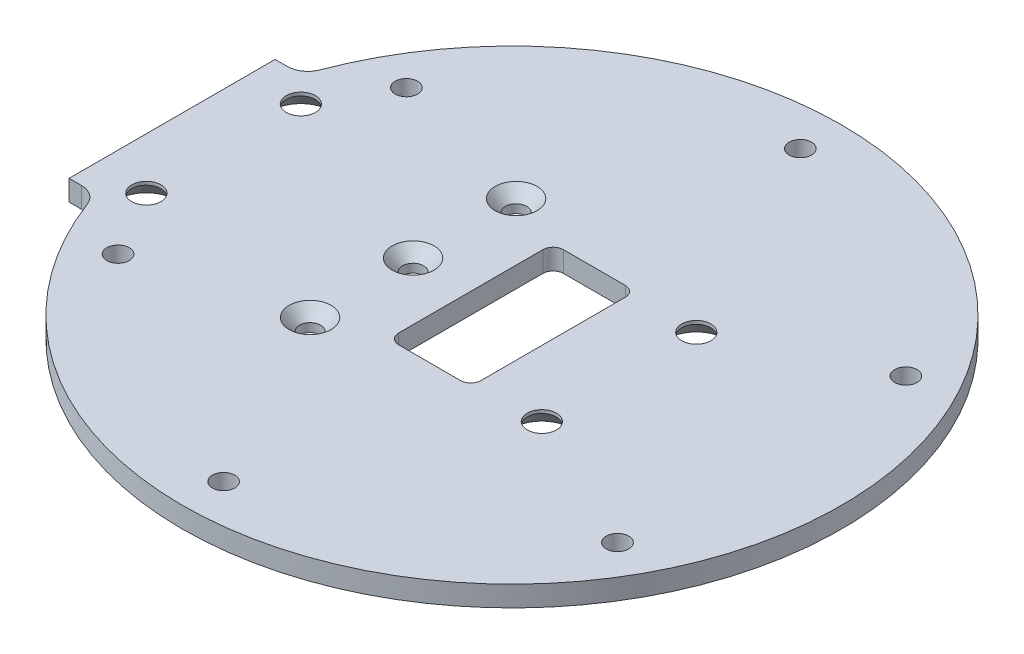
ISO-10303-21;
HEADER;
FILE_DESCRIPTION(('STEP AP214'),'2;1');
FILE_NAME('part.step','',(''),(''),'','','');
FILE_SCHEMA(('AUTOMOTIVE_DESIGN { 1 0 10303 214 1 1 1 1 }'));
ENDSEC;
DATA;
#1=APPLICATION_CONTEXT('core data for automotive mechanical design processes');
#2=APPLICATION_PROTOCOL_DEFINITION('international standard','automotive_design',2000,#1);
#3=PRODUCT_CONTEXT('',#1,'mechanical');
#4=PRODUCT('Part','Part','',(#3));
#5=PRODUCT_RELATED_PRODUCT_CATEGORY('part','',(#4));
#6=PRODUCT_DEFINITION_FORMATION('','',#4);
#7=PRODUCT_DEFINITION_CONTEXT('part definition',#1,'design');
#8=PRODUCT_DEFINITION('design','',#6,#7);
#9=PRODUCT_DEFINITION_SHAPE('','',#8);
#10=(LENGTH_UNIT() NAMED_UNIT(*) SI_UNIT(.MILLI.,.METRE.));
#11=(NAMED_UNIT(*) PLANE_ANGLE_UNIT() SI_UNIT($,.RADIAN.));
#12=(NAMED_UNIT(*) SI_UNIT($,.STERADIAN.) SOLID_ANGLE_UNIT());
#13=UNCERTAINTY_MEASURE_WITH_UNIT(LENGTH_MEASURE(1.E-05),#10,'distance_accuracy_value','');
#14=(GEOMETRIC_REPRESENTATION_CONTEXT(3) GLOBAL_UNCERTAINTY_ASSIGNED_CONTEXT((#13)) GLOBAL_UNIT_ASSIGNED_CONTEXT((#10,
#11,#12)) REPRESENTATION_CONTEXT('',''));
#15=CARTESIAN_POINT('',(0.,0.,0.));
#16=DIRECTION('',(0.,0.,1.));
#17=DIRECTION('',(1.,0.,0.));
#18=AXIS2_PLACEMENT_3D('',#15,#16,#17);
#19=CARTESIAN_POINT('',(0.,3.175,0.));
#20=DIRECTION('',(0.,-1.,0.));
#21=DIRECTION('',(0.,0.,-1.));
#22=AXIS2_PLACEMENT_3D('',#19,#20,#21);
#23=CYLINDRICAL_SURFACE('',#22,50.8);
#24=CARTESIAN_POINT('',(0.,0.,0.));
#25=DIRECTION('',(0.,1.,0.));
#26=DIRECTION('',(0.,0.,1.));
#27=AXIS2_PLACEMENT_3D('',#24,#25,#26);
#28=CIRCLE('',#27,50.8);
#29=CARTESIAN_POINT('',(-47.5307920591655,0.,17.9294117647059));
#30=VERTEX_POINT('',#29);
#31=CARTESIAN_POINT('',(-47.5307920591654,0.,-17.9294117647059));
#32=VERTEX_POINT('',#31);
#33=EDGE_CURVE('E163',#30,#32,#28,.T.);
#34=ORIENTED_EDGE('',*,*,#33,.T.);
#35=DIRECTION('',(0.,-1.,0.));
#36=VECTOR('',#35,1.);
#37=CARTESIAN_POINT('',(-47.5307920591655,3.175,-17.9294117647059));
#38=LINE('',#37,#36);
#39=CARTESIAN_POINT('',(-47.5307920591654,3.175,-17.9294117647059));
#40=VERTEX_POINT('',#39);
#41=EDGE_CURVE('E183',#32,#40,#38,.F.);
#42=ORIENTED_EDGE('',*,*,#41,.T.);
#43=CARTESIAN_POINT('',(0.,3.175,0.));
#44=DIRECTION('',(0.,1.,0.));
#45=DIRECTION('',(0.,0.,1.));
#46=AXIS2_PLACEMENT_3D('',#43,#44,#45);
#47=CIRCLE('',#46,50.8);
#48=CARTESIAN_POINT('',(-47.5307920591655,3.175,17.9294117647059));
#49=VERTEX_POINT('',#48);
#50=EDGE_CURVE('E166',#49,#40,#47,.T.);
#51=ORIENTED_EDGE('',*,*,#50,.F.);
#52=DIRECTION('',(0.,-1.,0.));
#53=VECTOR('',#52,1.);
#54=CARTESIAN_POINT('',(-47.5307920591655,3.175,17.9294117647059));
#55=LINE('',#54,#53);
#56=EDGE_CURVE('E180',#49,#30,#55,.T.);
#57=ORIENTED_EDGE('',*,*,#56,.T.);
#58=EDGE_LOOP('',(#34,#42,#51,#57));
#59=FACE_BOUND('',#58,.T.);
#60=ADVANCED_FACE('F36',(#59),#23,.T.);
#61=CARTESIAN_POINT('',(0.,3.175,0.));
#62=DIRECTION('',(0.,1.,0.));
#63=DIRECTION('',(0.,0.,1.));
#64=AXIS2_PLACEMENT_3D('',#61,#62,#63);
#65=PLANE('',#64);
#66=DIRECTION('',(0.,0.,1.));
#67=VECTOR('',#66,1.);
#68=CARTESIAN_POINT('',(-6.35,3.175,-12.7));
#69=LINE('',#68,#67);
#70=CARTESIAN_POINT('',(-6.35,3.175,-11.1125));
#71=VERTEX_POINT('',#70);
#72=CARTESIAN_POINT('',(-6.35,3.175,11.1125));
#73=VERTEX_POINT('',#72);
#74=EDGE_CURVE('E260',#71,#73,#69,.T.);
#75=ORIENTED_EDGE('',*,*,#74,.F.);
#76=CARTESIAN_POINT('',(-4.7625,3.175,-11.1125));
#77=DIRECTION('',(0.,1.,0.));
#78=DIRECTION('',(0.,0.,1.));
#79=AXIS2_PLACEMENT_3D('',#76,#77,#78);
#80=CIRCLE('',#79,1.5875);
#81=CARTESIAN_POINT('',(-4.7625,3.175,-12.7));
#82=VERTEX_POINT('',#81);
#83=EDGE_CURVE('E238',#71,#82,#80,.F.);
#84=ORIENTED_EDGE('',*,*,#83,.T.);
#85=DIRECTION('',(-1.,0.,0.));
#86=VECTOR('',#85,1.);
#87=CARTESIAN_POINT('',(6.35,3.175,-12.7));
#88=LINE('',#87,#86);
#89=CARTESIAN_POINT('',(4.7625,3.175,-12.7));
#90=VERTEX_POINT('',#89);
#91=EDGE_CURVE('E285',#90,#82,#88,.T.);
#92=ORIENTED_EDGE('',*,*,#91,.F.);
#93=CARTESIAN_POINT('',(4.7625,3.175,-11.1125));
#94=DIRECTION('',(0.,1.,0.));
#95=DIRECTION('',(0.,0.,1.));
#96=AXIS2_PLACEMENT_3D('',#93,#94,#95);
#97=CIRCLE('',#96,1.5875);
#98=CARTESIAN_POINT('',(6.35,3.175,-11.1125));
#99=VERTEX_POINT('',#98);
#100=EDGE_CURVE('E242',#90,#99,#97,.F.);
#101=ORIENTED_EDGE('',*,*,#100,.T.);
#102=DIRECTION('',(0.,0.,-1.));
#103=VECTOR('',#102,1.);
#104=CARTESIAN_POINT('',(6.35,3.175,-12.7));
#105=LINE('',#104,#103);
#106=CARTESIAN_POINT('',(6.35,3.175,11.1125));
#107=VERTEX_POINT('',#106);
#108=EDGE_CURVE('E255',#107,#99,#105,.T.);
#109=ORIENTED_EDGE('',*,*,#108,.F.);
#110=CARTESIAN_POINT('',(4.7625,3.175,11.1125));
#111=DIRECTION('',(0.,1.,0.));
#112=DIRECTION('',(0.,0.,1.));
#113=AXIS2_PLACEMENT_3D('',#110,#111,#112);
#114=CIRCLE('',#113,1.5875);
#115=CARTESIAN_POINT('',(4.7625,3.175,12.7));
#116=VERTEX_POINT('',#115);
#117=EDGE_CURVE('E44',#107,#116,#114,.F.);
#118=ORIENTED_EDGE('',*,*,#117,.T.);
#119=DIRECTION('',(1.,0.,0.));
#120=VECTOR('',#119,1.);
#121=CARTESIAN_POINT('',(6.35,3.175,12.7));
#122=LINE('',#121,#120);
#123=CARTESIAN_POINT('',(-4.7625,3.175,12.7));
#124=VERTEX_POINT('',#123);
#125=EDGE_CURVE('E253',#124,#116,#122,.T.);
#126=ORIENTED_EDGE('',*,*,#125,.F.);
#127=CARTESIAN_POINT('',(-4.7625,3.175,11.1125));
#128=DIRECTION('',(0.,1.,0.));
#129=DIRECTION('',(0.,0.,1.));
#130=AXIS2_PLACEMENT_3D('',#127,#128,#129);
#131=CIRCLE('',#130,1.5875);
#132=EDGE_CURVE('E246',#124,#73,#131,.F.);
#133=ORIENTED_EDGE('',*,*,#132,.T.);
#134=EDGE_LOOP('',(#75,#84,#92,#101,#109,#118,#126,#133));
#135=FACE_BOUND('',#134,.T.);
#136=CARTESIAN_POINT('',(-15.24,3.175,0.));
#137=DIRECTION('',(0.,1.,0.));
#138=DIRECTION('',(0.,0.,1.));
#139=AXIS2_PLACEMENT_3D('',#136,#137,#138);
#140=CIRCLE('',#139,3.2385);
#141=CARTESIAN_POINT('',(-15.24,3.175,3.2385));
#142=VERTEX_POINT('',#141);
#143=EDGE_CURVE('E276',#142,#142,#140,.T.);
#144=ORIENTED_EDGE('',*,*,#143,.F.);
#145=EDGE_LOOP('',(#144));
#146=FACE_BOUND('',#145,.T.);
#147=CARTESIAN_POINT('',(-15.24,3.175,-15.875));
#148=DIRECTION('',(0.,1.,0.));
#149=DIRECTION('',(0.,0.,1.));
#150=AXIS2_PLACEMENT_3D('',#147,#148,#149);
#151=CIRCLE('',#150,3.2385);
#152=CARTESIAN_POINT('',(-15.24,3.175,-12.6365));
#153=VERTEX_POINT('',#152);
#154=EDGE_CURVE('E296',#153,#153,#151,.T.);
#155=ORIENTED_EDGE('',*,*,#154,.F.);
#156=EDGE_LOOP('',(#155));
#157=FACE_BOUND('',#156,.T.);
#158=CARTESIAN_POINT('',(-15.24,3.175,15.875));
#159=DIRECTION('',(0.,1.,0.));
#160=DIRECTION('',(0.,0.,1.));
#161=AXIS2_PLACEMENT_3D('',#158,#159,#160);
#162=CIRCLE('',#161,3.2385);
#163=CARTESIAN_POINT('',(-15.24,3.175,19.1135));
#164=VERTEX_POINT('',#163);
#165=EDGE_CURVE('E305',#164,#164,#162,.T.);
#166=ORIENTED_EDGE('',*,*,#165,.F.);
#167=EDGE_LOOP('',(#166));
#168=FACE_BOUND('',#167,.T.);
#169=CARTESIAN_POINT('',(38.494829198218,3.175,-22.2250000000004));
#170=DIRECTION('',(0.,1.,0.));
#171=DIRECTION('',(0.,0.,1.));
#172=AXIS2_PLACEMENT_3D('',#169,#170,#171);
#173=CIRCLE('',#172,1.7272);
#174=CARTESIAN_POINT('',(38.494829198218,3.175,-20.4978000000004));
#175=VERTEX_POINT('',#174);
#176=EDGE_CURVE('E219',#175,#175,#173,.T.);
#177=ORIENTED_EDGE('',*,*,#176,.F.);
#178=EDGE_LOOP('',(#177));
#179=FACE_BOUND('',#178,.T.);
#180=CARTESIAN_POINT('',(38.4948291982185,3.175,22.2249999999996));
#181=DIRECTION('',(0.,1.,0.));
#182=DIRECTION('',(0.,0.,1.));
#183=AXIS2_PLACEMENT_3D('',#180,#181,#182);
#184=CIRCLE('',#183,1.7272);
#185=CARTESIAN_POINT('',(38.4948291982185,3.175,23.9521999999996));
#186=VERTEX_POINT('',#185);
#187=EDGE_CURVE('E215',#186,#186,#184,.T.);
#188=ORIENTED_EDGE('',*,*,#187,.F.);
#189=EDGE_LOOP('',(#188));
#190=FACE_BOUND('',#189,.T.);
#191=CARTESIAN_POINT('',(0.,3.175,44.45));
#192=DIRECTION('',(0.,1.,0.));
#193=DIRECTION('',(0.,0.,1.));
#194=AXIS2_PLACEMENT_3D('',#191,#192,#193);
#195=CIRCLE('',#194,1.7272);
#196=CARTESIAN_POINT('',(0.,3.175,46.1772));
#197=VERTEX_POINT('',#196);
#198=EDGE_CURVE('E211',#197,#197,#195,.T.);
#199=ORIENTED_EDGE('',*,*,#198,.F.);
#200=EDGE_LOOP('',(#199));
#201=FACE_BOUND('',#200,.T.);
#202=CARTESIAN_POINT('',(-38.4948291982182,3.175,22.2250000000002));
#203=DIRECTION('',(0.,1.,0.));
#204=DIRECTION('',(0.,0.,1.));
#205=AXIS2_PLACEMENT_3D('',#202,#203,#204);
#206=CIRCLE('',#205,1.7272);
#207=CARTESIAN_POINT('',(-38.4948291982182,3.175,23.9522000000002));
#208=VERTEX_POINT('',#207);
#209=EDGE_CURVE('E207',#208,#208,#206,.T.);
#210=ORIENTED_EDGE('',*,*,#209,.F.);
#211=EDGE_LOOP('',(#210));
#212=FACE_BOUND('',#211,.T.);
#213=CARTESIAN_POINT('',(-38.4948291982183,3.175,-22.2249999999999));
#214=DIRECTION('',(0.,1.,0.));
#215=DIRECTION('',(0.,0.,1.));
#216=AXIS2_PLACEMENT_3D('',#213,#214,#215);
#217=CIRCLE('',#216,1.7272);
#218=CARTESIAN_POINT('',(-38.4948291982183,3.175,-20.4977999999999));
#219=VERTEX_POINT('',#218);
#220=EDGE_CURVE('E203',#219,#219,#217,.T.);
#221=ORIENTED_EDGE('',*,*,#220,.F.);
#222=EDGE_LOOP('',(#221));
#223=FACE_BOUND('',#222,.T.);
#224=CARTESIAN_POINT('',(0.,3.175,-44.45));
#225=DIRECTION('',(0.,1.,0.));
#226=DIRECTION('',(0.,0.,1.));
#227=AXIS2_PLACEMENT_3D('',#224,#225,#226);
#228=CIRCLE('',#227,1.7272);
#229=CARTESIAN_POINT('',(0.,3.175,-42.7228));
#230=VERTEX_POINT('',#229);
#231=EDGE_CURVE('E199',#230,#230,#228,.T.);
#232=ORIENTED_EDGE('',*,*,#231,.F.);
#233=EDGE_LOOP('',(#232));
#234=FACE_BOUND('',#233,.T.);
#235=CARTESIAN_POINT('',(-44.45,3.175,11.90625));
#236=DIRECTION('',(0.,-1.,0.));
#237=DIRECTION('',(0.,0.,-1.));
#238=AXIS2_PLACEMENT_3D('',#235,#236,#237);
#239=CIRCLE('',#238,2.2479);
#240=CARTESIAN_POINT('',(-44.45,3.175,9.65835));
#241=VERTEX_POINT('',#240);
#242=EDGE_CURVE('E331',#241,#241,#239,.T.);
#243=ORIENTED_EDGE('',*,*,#242,.T.);
#244=EDGE_LOOP('',(#243));
#245=FACE_BOUND('',#244,.T.);
#246=CARTESIAN_POINT('',(-44.45,3.175,-11.90625));
#247=DIRECTION('',(0.,-1.,0.));
#248=DIRECTION('',(0.,0.,-1.));
#249=AXIS2_PLACEMENT_3D('',#246,#247,#248);
#250=CIRCLE('',#249,2.2479);
#251=CARTESIAN_POINT('',(-44.45,3.175,-14.15415));
#252=VERTEX_POINT('',#251);
#253=EDGE_CURVE('E340',#252,#252,#250,.T.);
#254=ORIENTED_EDGE('',*,*,#253,.T.);
#255=EDGE_LOOP('',(#254));
#256=FACE_BOUND('',#255,.T.);
#257=CARTESIAN_POINT('',(16.51,3.175,-11.90625));
#258=DIRECTION('',(0.,-1.,0.));
#259=DIRECTION('',(0.,0.,-1.));
#260=AXIS2_PLACEMENT_3D('',#257,#258,#259);
#261=CIRCLE('',#260,2.2479);
#262=CARTESIAN_POINT('',(16.51,3.175,-14.15415));
#263=VERTEX_POINT('',#262);
#264=EDGE_CURVE('E349',#263,#263,#261,.T.);
#265=ORIENTED_EDGE('',*,*,#264,.T.);
#266=EDGE_LOOP('',(#265));
#267=FACE_BOUND('',#266,.T.);
#268=CARTESIAN_POINT('',(16.51,3.175,11.90625));
#269=DIRECTION('',(0.,-1.,0.));
#270=DIRECTION('',(0.,0.,-1.));
#271=AXIS2_PLACEMENT_3D('',#268,#269,#270);
#272=CIRCLE('',#271,2.2479);
#273=CARTESIAN_POINT('',(16.51,3.175,9.65835));
#274=VERTEX_POINT('',#273);
#275=EDGE_CURVE('E174',#274,#274,#272,.T.);
#276=ORIENTED_EDGE('',*,*,#275,.T.);
#277=EDGE_LOOP('',(#276));
#278=FACE_BOUND('',#277,.T.);
#279=DIRECTION('',(-1.,0.,0.));
#280=VECTOR('',#279,1.);
#281=CARTESIAN_POINT('',(0.,3.175,15.875));
#282=LINE('',#281,#280);
#283=CARTESIAN_POINT('',(-50.5014665628633,3.175,15.875));
#284=VERTEX_POINT('',#283);
#285=CARTESIAN_POINT('',(-52.3875,3.175,15.875));
#286=VERTEX_POINT('',#285);
#287=EDGE_CURVE('E138',#284,#286,#282,.T.);
#288=ORIENTED_EDGE('',*,*,#287,.F.);
#289=CARTESIAN_POINT('',(-50.5014665628633,3.175,19.05));
#290=DIRECTION('',(0.,1.,0.));
#291=DIRECTION('',(0.,0.,1.));
#292=AXIS2_PLACEMENT_3D('',#289,#290,#291);
#293=CIRCLE('',#292,3.175);
#294=EDGE_CURVE('E192',#284,#49,#293,.F.);
#295=ORIENTED_EDGE('',*,*,#294,.T.);
#296=ORIENTED_EDGE('',*,*,#50,.T.);
#297=CARTESIAN_POINT('',(-50.5014665628633,3.175,-19.05));
#298=DIRECTION('',(0.,1.,0.));
#299=DIRECTION('',(0.,0.,1.));
#300=AXIS2_PLACEMENT_3D('',#297,#298,#299);
#301=CIRCLE('',#300,3.175);
#302=CARTESIAN_POINT('',(-50.5014665628633,3.175,-15.875));
#303=VERTEX_POINT('',#302);
#304=EDGE_CURVE('E188',#40,#303,#301,.F.);
#305=ORIENTED_EDGE('',*,*,#304,.T.);
#306=DIRECTION('',(-1.,0.,0.));
#307=VECTOR('',#306,1.);
#308=CARTESIAN_POINT('',(0.,3.175,-15.875));
#309=LINE('',#308,#307);
#310=CARTESIAN_POINT('',(-52.3875,3.175,-15.875));
#311=VERTEX_POINT('',#310);
#312=EDGE_CURVE('E161',#303,#311,#309,.T.);
#313=ORIENTED_EDGE('',*,*,#312,.T.);
#314=DIRECTION('',(0.,0.,1.));
#315=VECTOR('',#314,1.);
#316=CARTESIAN_POINT('',(-52.3875,3.175,-111.901421356237));
#317=LINE('',#316,#315);
#318=EDGE_CURVE('E155',#311,#286,#317,.T.);
#319=ORIENTED_EDGE('',*,*,#318,.T.);
#320=EDGE_LOOP('',(#288,#295,#296,#305,#313,#319));
#321=FACE_BOUND('',#320,.T.);
#322=ADVANCED_FACE('F159',(#135,#146,#157,#168,#179,#190,#201,#212,#223,#234,#245,#256,#267,
#278,#321),#65,.T.);
#323=CARTESIAN_POINT('',(0.,0.,0.));
#324=DIRECTION('',(0.,1.,0.));
#325=DIRECTION('',(0.,0.,1.));
#326=AXIS2_PLACEMENT_3D('',#323,#324,#325);
#327=PLANE('',#326);
#328=DIRECTION('',(0.,0.,-1.));
#329=VECTOR('',#328,1.);
#330=CARTESIAN_POINT('',(6.35,0.,-12.7));
#331=LINE('',#330,#329);
#332=CARTESIAN_POINT('',(6.35,0.,11.1125));
#333=VERTEX_POINT('',#332);
#334=CARTESIAN_POINT('',(6.35,0.,-11.1125));
#335=VERTEX_POINT('',#334);
#336=EDGE_CURVE('E267',#333,#335,#331,.T.);
#337=ORIENTED_EDGE('',*,*,#336,.T.);
#338=CARTESIAN_POINT('',(4.7625,0.,-11.1125));
#339=DIRECTION('',(0.,1.,0.));
#340=DIRECTION('',(0.,0.,1.));
#341=AXIS2_PLACEMENT_3D('',#338,#339,#340);
#342=CIRCLE('',#341,1.5875);
#343=CARTESIAN_POINT('',(4.7625,0.,-12.7));
#344=VERTEX_POINT('',#343);
#345=EDGE_CURVE('E244',#335,#344,#342,.T.);
#346=ORIENTED_EDGE('',*,*,#345,.T.);
#347=DIRECTION('',(-1.,0.,0.));
#348=VECTOR('',#347,1.);
#349=CARTESIAN_POINT('',(6.35,0.,-12.7));
#350=LINE('',#349,#348);
#351=CARTESIAN_POINT('',(-4.7625,0.,-12.7));
#352=VERTEX_POINT('',#351);
#353=EDGE_CURVE('E273',#344,#352,#350,.T.);
#354=ORIENTED_EDGE('',*,*,#353,.T.);
#355=CARTESIAN_POINT('',(-4.7625,0.,-11.1125));
#356=DIRECTION('',(0.,1.,0.));
#357=DIRECTION('',(0.,0.,1.));
#358=AXIS2_PLACEMENT_3D('',#355,#356,#357);
#359=CIRCLE('',#358,1.5875);
#360=CARTESIAN_POINT('',(-6.35,0.,-11.1125));
#361=VERTEX_POINT('',#360);
#362=EDGE_CURVE('E240',#352,#361,#359,.T.);
#363=ORIENTED_EDGE('',*,*,#362,.T.);
#364=DIRECTION('',(0.,0.,1.));
#365=VECTOR('',#364,1.);
#366=CARTESIAN_POINT('',(-6.35,0.,-12.7));
#367=LINE('',#366,#365);
#368=CARTESIAN_POINT('',(-6.35,0.,11.1125));
#369=VERTEX_POINT('',#368);
#370=EDGE_CURVE('E278',#361,#369,#367,.T.);
#371=ORIENTED_EDGE('',*,*,#370,.T.);
#372=CARTESIAN_POINT('',(-4.7625,0.,11.1125));
#373=DIRECTION('',(0.,1.,0.));
#374=DIRECTION('',(0.,0.,1.));
#375=AXIS2_PLACEMENT_3D('',#372,#373,#374);
#376=CIRCLE('',#375,1.5875);
#377=CARTESIAN_POINT('',(-4.7625,0.,12.7));
#378=VERTEX_POINT('',#377);
#379=EDGE_CURVE('E58',#369,#378,#376,.T.);
#380=ORIENTED_EDGE('',*,*,#379,.T.);
#381=DIRECTION('',(1.,0.,0.));
#382=VECTOR('',#381,1.);
#383=CARTESIAN_POINT('',(6.35,0.,12.7));
#384=LINE('',#383,#382);
#385=CARTESIAN_POINT('',(4.7625,0.,12.7));
#386=VERTEX_POINT('',#385);
#387=EDGE_CURVE('E269',#378,#386,#384,.T.);
#388=ORIENTED_EDGE('',*,*,#387,.T.);
#389=CARTESIAN_POINT('',(4.7625,0.,11.1125));
#390=DIRECTION('',(0.,1.,0.));
#391=DIRECTION('',(0.,0.,1.));
#392=AXIS2_PLACEMENT_3D('',#389,#390,#391);
#393=CIRCLE('',#392,1.5875);
#394=EDGE_CURVE('E11',#386,#333,#393,.T.);
#395=ORIENTED_EDGE('',*,*,#394,.T.);
#396=EDGE_LOOP('',(#337,#346,#354,#363,#371,#380,#388,#395));
#397=FACE_BOUND('',#396,.T.);
#398=CARTESIAN_POINT('',(-15.24,0.,0.));
#399=DIRECTION('',(0.,1.,0.));
#400=DIRECTION('',(0.,0.,1.));
#401=AXIS2_PLACEMENT_3D('',#398,#399,#400);
#402=CIRCLE('',#401,1.63195);
#403=CARTESIAN_POINT('',(-15.24,0.,1.63195));
#404=VERTEX_POINT('',#403);
#405=EDGE_CURVE('E293',#404,#404,#402,.T.);
#406=ORIENTED_EDGE('',*,*,#405,.T.);
#407=EDGE_LOOP('',(#406));
#408=FACE_BOUND('',#407,.T.);
#409=CARTESIAN_POINT('',(-15.24,0.,-15.875));
#410=DIRECTION('',(0.,1.,0.));
#411=DIRECTION('',(0.,0.,1.));
#412=AXIS2_PLACEMENT_3D('',#409,#410,#411);
#413=CIRCLE('',#412,1.63195);
#414=CARTESIAN_POINT('',(-15.24,0.,-14.24305));
#415=VERTEX_POINT('',#414);
#416=EDGE_CURVE('E302',#415,#415,#413,.T.);
#417=ORIENTED_EDGE('',*,*,#416,.T.);
#418=EDGE_LOOP('',(#417));
#419=FACE_BOUND('',#418,.T.);
#420=CARTESIAN_POINT('',(-15.24,0.,15.875));
#421=DIRECTION('',(0.,1.,0.));
#422=DIRECTION('',(0.,0.,1.));
#423=AXIS2_PLACEMENT_3D('',#420,#421,#422);
#424=CIRCLE('',#423,1.63195);
#425=CARTESIAN_POINT('',(-15.24,0.,17.50695));
#426=VERTEX_POINT('',#425);
#427=EDGE_CURVE('E311',#426,#426,#424,.T.);
#428=ORIENTED_EDGE('',*,*,#427,.T.);
#429=EDGE_LOOP('',(#428));
#430=FACE_BOUND('',#429,.T.);
#431=CARTESIAN_POINT('',(38.494829198218,0.,-22.2250000000004));
#432=DIRECTION('',(0.,1.,0.));
#433=DIRECTION('',(0.,0.,1.));
#434=AXIS2_PLACEMENT_3D('',#431,#432,#433);
#435=CIRCLE('',#434,1.7272);
#436=CARTESIAN_POINT('',(38.494829198218,0.,-20.4978000000004));
#437=VERTEX_POINT('',#436);
#438=EDGE_CURVE('E216',#437,#437,#435,.T.);
#439=ORIENTED_EDGE('',*,*,#438,.T.);
#440=EDGE_LOOP('',(#439));
#441=FACE_BOUND('',#440,.T.);
#442=CARTESIAN_POINT('',(38.4948291982185,0.,22.2249999999996));
#443=DIRECTION('',(0.,1.,0.));
#444=DIRECTION('',(0.,0.,1.));
#445=AXIS2_PLACEMENT_3D('',#442,#443,#444);
#446=CIRCLE('',#445,1.7272);
#447=CARTESIAN_POINT('',(38.4948291982185,0.,23.9521999999996));
#448=VERTEX_POINT('',#447);
#449=EDGE_CURVE('E212',#448,#448,#446,.T.);
#450=ORIENTED_EDGE('',*,*,#449,.T.);
#451=EDGE_LOOP('',(#450));
#452=FACE_BOUND('',#451,.T.);
#453=CARTESIAN_POINT('',(0.,0.,44.45));
#454=DIRECTION('',(0.,1.,0.));
#455=DIRECTION('',(0.,0.,1.));
#456=AXIS2_PLACEMENT_3D('',#453,#454,#455);
#457=CIRCLE('',#456,1.7272);
#458=CARTESIAN_POINT('',(0.,0.,46.1772));
#459=VERTEX_POINT('',#458);
#460=EDGE_CURVE('E208',#459,#459,#457,.T.);
#461=ORIENTED_EDGE('',*,*,#460,.T.);
#462=EDGE_LOOP('',(#461));
#463=FACE_BOUND('',#462,.T.);
#464=CARTESIAN_POINT('',(-38.4948291982182,0.,22.2250000000002));
#465=DIRECTION('',(0.,1.,0.));
#466=DIRECTION('',(0.,0.,1.));
#467=AXIS2_PLACEMENT_3D('',#464,#465,#466);
#468=CIRCLE('',#467,1.7272);
#469=CARTESIAN_POINT('',(-38.4948291982182,0.,23.9522000000002));
#470=VERTEX_POINT('',#469);
#471=EDGE_CURVE('E204',#470,#470,#468,.T.);
#472=ORIENTED_EDGE('',*,*,#471,.T.);
#473=EDGE_LOOP('',(#472));
#474=FACE_BOUND('',#473,.T.);
#475=CARTESIAN_POINT('',(-38.4948291982183,0.,-22.2249999999999));
#476=DIRECTION('',(0.,1.,0.));
#477=DIRECTION('',(0.,0.,1.));
#478=AXIS2_PLACEMENT_3D('',#475,#476,#477);
#479=CIRCLE('',#478,1.7272);
#480=CARTESIAN_POINT('',(-38.4948291982183,0.,-20.4977999999999));
#481=VERTEX_POINT('',#480);
#482=EDGE_CURVE('E200',#481,#481,#479,.T.);
#483=ORIENTED_EDGE('',*,*,#482,.T.);
#484=EDGE_LOOP('',(#483));
#485=FACE_BOUND('',#484,.T.);
#486=CARTESIAN_POINT('',(0.,0.,-44.45));
#487=DIRECTION('',(0.,1.,0.));
#488=DIRECTION('',(0.,0.,1.));
#489=AXIS2_PLACEMENT_3D('',#486,#487,#488);
#490=CIRCLE('',#489,1.7272);
#491=CARTESIAN_POINT('',(0.,0.,-42.7228));
#492=VERTEX_POINT('',#491);
#493=EDGE_CURVE('E195',#492,#492,#490,.T.);
#494=ORIENTED_EDGE('',*,*,#493,.T.);
#495=EDGE_LOOP('',(#494));
#496=FACE_BOUND('',#495,.T.);
#497=CARTESIAN_POINT('',(-44.45,0.,11.90625));
#498=DIRECTION('',(0.,-1.,0.));
#499=DIRECTION('',(0.,0.,-1.));
#500=AXIS2_PLACEMENT_3D('',#497,#498,#499);
#501=CIRCLE('',#500,4.5593);
#502=CARTESIAN_POINT('',(-44.45,0.,7.34694999999999));
#503=VERTEX_POINT('',#502);
#504=EDGE_CURVE('E198',#503,#503,#501,.T.);
#505=ORIENTED_EDGE('',*,*,#504,.F.);
#506=EDGE_LOOP('',(#505));
#507=FACE_BOUND('',#506,.T.);
#508=CARTESIAN_POINT('',(-44.45,0.,-11.90625));
#509=DIRECTION('',(0.,-1.,0.));
#510=DIRECTION('',(0.,0.,-1.));
#511=AXIS2_PLACEMENT_3D('',#508,#509,#510);
#512=CIRCLE('',#511,4.5593);
#513=CARTESIAN_POINT('',(-44.45,0.,-16.46555));
#514=VERTEX_POINT('',#513);
#515=EDGE_CURVE('E334',#514,#514,#512,.T.);
#516=ORIENTED_EDGE('',*,*,#515,.F.);
#517=EDGE_LOOP('',(#516));
#518=FACE_BOUND('',#517,.T.);
#519=CARTESIAN_POINT('',(16.51,0.,-11.90625));
#520=DIRECTION('',(0.,-1.,0.));
#521=DIRECTION('',(0.,0.,-1.));
#522=AXIS2_PLACEMENT_3D('',#519,#520,#521);
#523=CIRCLE('',#522,4.5593);
#524=CARTESIAN_POINT('',(16.51,0.,-16.46555));
#525=VERTEX_POINT('',#524);
#526=EDGE_CURVE('E343',#525,#525,#523,.T.);
#527=ORIENTED_EDGE('',*,*,#526,.F.);
#528=EDGE_LOOP('',(#527));
#529=FACE_BOUND('',#528,.T.);
#530=CARTESIAN_POINT('',(16.51,0.,11.90625));
#531=DIRECTION('',(0.,-1.,0.));
#532=DIRECTION('',(0.,0.,-1.));
#533=AXIS2_PLACEMENT_3D('',#530,#531,#532);
#534=CIRCLE('',#533,4.5593);
#535=CARTESIAN_POINT('',(16.51,0.,7.34695));
#536=VERTEX_POINT('',#535);
#537=EDGE_CURVE('E352',#536,#536,#534,.T.);
#538=ORIENTED_EDGE('',*,*,#537,.F.);
#539=EDGE_LOOP('',(#538));
#540=FACE_BOUND('',#539,.T.);
#541=ORIENTED_EDGE('',*,*,#33,.F.);
#542=CARTESIAN_POINT('',(-50.5014665628633,0.,19.05));
#543=DIRECTION('',(0.,1.,0.));
#544=DIRECTION('',(0.,0.,1.));
#545=AXIS2_PLACEMENT_3D('',#542,#543,#544);
#546=CIRCLE('',#545,3.175);
#547=CARTESIAN_POINT('',(-50.5014665628633,0.,15.875));
#548=VERTEX_POINT('',#547);
#549=EDGE_CURVE('E190',#30,#548,#546,.T.);
#550=ORIENTED_EDGE('',*,*,#549,.T.);
#551=DIRECTION('',(-1.,0.,0.));
#552=VECTOR('',#551,1.);
#553=CARTESIAN_POINT('',(0.,0.,15.875));
#554=LINE('',#553,#552);
#555=CARTESIAN_POINT('',(-52.3875,0.,15.875));
#556=VERTEX_POINT('',#555);
#557=EDGE_CURVE('E168',#548,#556,#554,.T.);
#558=ORIENTED_EDGE('',*,*,#557,.T.);
#559=DIRECTION('',(0.,0.,1.));
#560=VECTOR('',#559,1.);
#561=CARTESIAN_POINT('',(-52.3875,0.,-111.901421356237));
#562=LINE('',#561,#560);
#563=CARTESIAN_POINT('',(-52.3875,0.,-15.875));
#564=VERTEX_POINT('',#563);
#565=EDGE_CURVE('E149',#564,#556,#562,.T.);
#566=ORIENTED_EDGE('',*,*,#565,.F.);
#567=DIRECTION('',(-1.,0.,0.));
#568=VECTOR('',#567,1.);
#569=CARTESIAN_POINT('',(0.,0.,-15.875));
#570=LINE('',#569,#568);
#571=CARTESIAN_POINT('',(-50.5014665628633,0.,-15.875));
#572=VERTEX_POINT('',#571);
#573=EDGE_CURVE('E157',#572,#564,#570,.T.);
#574=ORIENTED_EDGE('',*,*,#573,.F.);
#575=CARTESIAN_POINT('',(-50.5014665628633,0.,-19.05));
#576=DIRECTION('',(0.,1.,0.));
#577=DIRECTION('',(0.,0.,1.));
#578=AXIS2_PLACEMENT_3D('',#575,#576,#577);
#579=CIRCLE('',#578,3.175);
#580=EDGE_CURVE('E186',#572,#32,#579,.T.);
#581=ORIENTED_EDGE('',*,*,#580,.T.);
#582=EDGE_LOOP('',(#541,#550,#558,#566,#574,#581));
#583=FACE_BOUND('',#582,.T.);
#584=ADVANCED_FACE('F265',(#397,#408,#419,#430,#441,#452,#463,#474,#485,#496,#507,#518,#529,
#540,#583),#327,.F.);
#585=CARTESIAN_POINT('',(-52.3875,35.1927023152129,-111.901421356237));
#586=DIRECTION('',(1.,0.,0.));
#587=DIRECTION('',(0.,0.,-1.));
#588=AXIS2_PLACEMENT_3D('',#585,#586,#587);
#589=PLANE('',#588);
#590=ORIENTED_EDGE('',*,*,#318,.F.);
#591=DIRECTION('',(0.,-1.,0.));
#592=VECTOR('',#591,1.);
#593=CARTESIAN_POINT('',(-52.3875,35.1927023152129,-15.875));
#594=LINE('',#593,#592);
#595=EDGE_CURVE('E172',#311,#564,#594,.T.);
#596=ORIENTED_EDGE('',*,*,#595,.T.);
#597=ORIENTED_EDGE('',*,*,#565,.T.);
#598=DIRECTION('',(0.,-1.,0.));
#599=VECTOR('',#598,1.);
#600=CARTESIAN_POINT('',(-52.3875,35.1927023152129,15.875));
#601=LINE('',#600,#599);
#602=EDGE_CURVE('E142',#286,#556,#601,.T.);
#603=ORIENTED_EDGE('',*,*,#602,.F.);
#604=EDGE_LOOP('',(#590,#596,#597,#603));
#605=FACE_BOUND('',#604,.T.);
#606=ADVANCED_FACE('F153',(#605),#589,.F.);
#607=CARTESIAN_POINT('',(0.,35.1927023152129,15.875));
#608=DIRECTION('',(0.,0.,1.));
#609=DIRECTION('',(1.,0.,0.));
#610=AXIS2_PLACEMENT_3D('',#607,#608,#609);
#611=PLANE('',#610);
#612=ORIENTED_EDGE('',*,*,#557,.F.);
#613=DIRECTION('',(0.,-1.,0.));
#614=VECTOR('',#613,1.);
#615=CARTESIAN_POINT('',(-50.5014665628633,35.1927023152129,15.875));
#616=LINE('',#615,#614);
#617=EDGE_CURVE('E145',#548,#284,#616,.F.);
#618=ORIENTED_EDGE('',*,*,#617,.T.);
#619=ORIENTED_EDGE('',*,*,#287,.T.);
#620=ORIENTED_EDGE('',*,*,#602,.T.);
#621=EDGE_LOOP('',(#612,#618,#619,#620));
#622=FACE_BOUND('',#621,.T.);
#623=ADVANCED_FACE('F141',(#622),#611,.T.);
#624=CARTESIAN_POINT('',(0.,35.1927023152129,-15.875));
#625=DIRECTION('',(0.,0.,1.));
#626=DIRECTION('',(1.,0.,0.));
#627=AXIS2_PLACEMENT_3D('',#624,#625,#626);
#628=PLANE('',#627);
#629=ORIENTED_EDGE('',*,*,#312,.F.);
#630=DIRECTION('',(0.,1.,0.));
#631=VECTOR('',#630,1.);
#632=CARTESIAN_POINT('',(-50.5014665628633,0.,-15.875));
#633=LINE('',#632,#631);
#634=EDGE_CURVE('E176',#303,#572,#633,.F.);
#635=ORIENTED_EDGE('',*,*,#634,.T.);
#636=ORIENTED_EDGE('',*,*,#573,.T.);
#637=ORIENTED_EDGE('',*,*,#595,.F.);
#638=EDGE_LOOP('',(#629,#635,#636,#637));
#639=FACE_BOUND('',#638,.T.);
#640=ADVANCED_FACE('F363',(#639),#628,.F.);
#641=CARTESIAN_POINT('',(-50.5014665628633,3.175,-19.05));
#642=DIRECTION('',(0.,-1.,0.));
#643=DIRECTION('',(0.,0.,-1.));
#644=AXIS2_PLACEMENT_3D('',#641,#642,#643);
#645=CYLINDRICAL_SURFACE('',#644,3.175);
#646=ORIENTED_EDGE('',*,*,#304,.F.);
#647=ORIENTED_EDGE('',*,*,#41,.F.);
#648=ORIENTED_EDGE('',*,*,#580,.F.);
#649=ORIENTED_EDGE('',*,*,#634,.F.);
#650=EDGE_LOOP('',(#646,#647,#648,#649));
#651=FACE_BOUND('',#650,.T.);
#652=ADVANCED_FACE('F375',(#651),#645,.F.);
#653=CARTESIAN_POINT('',(-50.5014665628633,3.175,19.05));
#654=DIRECTION('',(0.,-1.,0.));
#655=DIRECTION('',(0.,0.,-1.));
#656=AXIS2_PLACEMENT_3D('',#653,#654,#655);
#657=CYLINDRICAL_SURFACE('',#656,3.175);
#658=ORIENTED_EDGE('',*,*,#294,.F.);
#659=ORIENTED_EDGE('',*,*,#617,.F.);
#660=ORIENTED_EDGE('',*,*,#549,.F.);
#661=ORIENTED_EDGE('',*,*,#56,.F.);
#662=EDGE_LOOP('',(#658,#659,#660,#661));
#663=FACE_BOUND('',#662,.T.);
#664=ADVANCED_FACE('F368',(#663),#657,.F.);
#665=CARTESIAN_POINT('',(16.51,0.,11.90625));
#666=DIRECTION('',(0.,-1.,0.));
#667=DIRECTION('',(0.,0.,-1.));
#668=AXIS2_PLACEMENT_3D('',#665,#666,#667);
#669=CYLINDRICAL_SURFACE('',#668,2.2479);
#670=ORIENTED_EDGE('',*,*,#275,.F.);
#671=EDGE_LOOP('',(#670));
#672=FACE_BOUND('',#671,.T.);
#673=CARTESIAN_POINT('',(16.51,2.65896153645064,11.90625));
#674=DIRECTION('',(0.,-1.,0.));
#675=DIRECTION('',(0.,0.,-1.));
#676=AXIS2_PLACEMENT_3D('',#673,#674,#675);
#677=CIRCLE('',#676,2.2479);
#678=CARTESIAN_POINT('',(16.51,2.65896153645064,9.65835));
#679=VERTEX_POINT('',#678);
#680=EDGE_CURVE('E355',#679,#679,#677,.T.);
#681=ORIENTED_EDGE('',*,*,#680,.T.);
#682=EDGE_LOOP('',(#681));
#683=FACE_BOUND('',#682,.T.);
#684=ADVANCED_FACE('F382',(#672,#683),#669,.F.);
#685=CARTESIAN_POINT('',(16.51,0.,11.90625));
#686=DIRECTION('',(0.,-1.,0.));
#687=DIRECTION('',(0.,0.,-1.));
#688=AXIS2_PLACEMENT_3D('',#685,#686,#687);
#689=CONICAL_SURFACE('',#688,4.5593,0.715584993317675);
#690=ORIENTED_EDGE('',*,*,#680,.F.);
#691=EDGE_LOOP('',(#690));
#692=FACE_BOUND('',#691,.T.);
#693=ORIENTED_EDGE('',*,*,#537,.T.);
#694=EDGE_LOOP('',(#693));
#695=FACE_BOUND('',#694,.T.);
#696=ADVANCED_FACE('F400',(#692,#695),#689,.F.);
#697=CARTESIAN_POINT('',(16.51,0.,-11.90625));
#698=DIRECTION('',(0.,-1.,0.));
#699=DIRECTION('',(0.,0.,-1.));
#700=AXIS2_PLACEMENT_3D('',#697,#698,#699);
#701=CYLINDRICAL_SURFACE('',#700,2.2479);
#702=ORIENTED_EDGE('',*,*,#264,.F.);
#703=EDGE_LOOP('',(#702));
#704=FACE_BOUND('',#703,.T.);
#705=CARTESIAN_POINT('',(16.51,2.65896153645064,-11.90625));
#706=DIRECTION('',(0.,-1.,0.));
#707=DIRECTION('',(0.,0.,-1.));
#708=AXIS2_PLACEMENT_3D('',#705,#706,#707);
#709=CIRCLE('',#708,2.2479);
#710=CARTESIAN_POINT('',(16.51,2.65896153645064,-14.15415));
#711=VERTEX_POINT('',#710);
#712=EDGE_CURVE('E346',#711,#711,#709,.T.);
#713=ORIENTED_EDGE('',*,*,#712,.T.);
#714=EDGE_LOOP('',(#713));
#715=FACE_BOUND('',#714,.T.);
#716=ADVANCED_FACE('F404',(#704,#715),#701,.F.);
#717=CARTESIAN_POINT('',(16.51,0.,-11.90625));
#718=DIRECTION('',(0.,-1.,0.));
#719=DIRECTION('',(0.,0.,-1.));
#720=AXIS2_PLACEMENT_3D('',#717,#718,#719);
#721=CONICAL_SURFACE('',#720,4.5593,0.715584993317675);
#722=ORIENTED_EDGE('',*,*,#712,.F.);
#723=EDGE_LOOP('',(#722));
#724=FACE_BOUND('',#723,.T.);
#725=ORIENTED_EDGE('',*,*,#526,.T.);
#726=EDGE_LOOP('',(#725));
#727=FACE_BOUND('',#726,.T.);
#728=ADVANCED_FACE('F408',(#724,#727),#721,.F.);
#729=CARTESIAN_POINT('',(-44.45,0.,-11.90625));
#730=DIRECTION('',(0.,-1.,0.));
#731=DIRECTION('',(0.,0.,-1.));
#732=AXIS2_PLACEMENT_3D('',#729,#730,#731);
#733=CYLINDRICAL_SURFACE('',#732,2.2479);
#734=ORIENTED_EDGE('',*,*,#253,.F.);
#735=EDGE_LOOP('',(#734));
#736=FACE_BOUND('',#735,.T.);
#737=CARTESIAN_POINT('',(-44.45,2.65896153645064,-11.90625));
#738=DIRECTION('',(0.,-1.,0.));
#739=DIRECTION('',(0.,0.,-1.));
#740=AXIS2_PLACEMENT_3D('',#737,#738,#739);
#741=CIRCLE('',#740,2.2479);
#742=CARTESIAN_POINT('',(-44.45,2.65896153645064,-14.15415));
#743=VERTEX_POINT('',#742);
#744=EDGE_CURVE('E337',#743,#743,#741,.T.);
#745=ORIENTED_EDGE('',*,*,#744,.T.);
#746=EDGE_LOOP('',(#745));
#747=FACE_BOUND('',#746,.T.);
#748=ADVANCED_FACE('F412',(#736,#747),#733,.F.);
#749=CARTESIAN_POINT('',(-44.45,0.,-11.90625));
#750=DIRECTION('',(0.,-1.,0.));
#751=DIRECTION('',(0.,0.,-1.));
#752=AXIS2_PLACEMENT_3D('',#749,#750,#751);
#753=CONICAL_SURFACE('',#752,4.5593,0.715584993317676);
#754=ORIENTED_EDGE('',*,*,#744,.F.);
#755=EDGE_LOOP('',(#754));
#756=FACE_BOUND('',#755,.T.);
#757=ORIENTED_EDGE('',*,*,#515,.T.);
#758=EDGE_LOOP('',(#757));
#759=FACE_BOUND('',#758,.T.);
#760=ADVANCED_FACE('F416',(#756,#759),#753,.F.);
#761=CARTESIAN_POINT('',(-44.45,0.,11.90625));
#762=DIRECTION('',(0.,-1.,0.));
#763=DIRECTION('',(0.,0.,-1.));
#764=AXIS2_PLACEMENT_3D('',#761,#762,#763);
#765=CYLINDRICAL_SURFACE('',#764,2.2479);
#766=ORIENTED_EDGE('',*,*,#242,.F.);
#767=EDGE_LOOP('',(#766));
#768=FACE_BOUND('',#767,.T.);
#769=CARTESIAN_POINT('',(-44.45,2.65896153645064,11.90625));
#770=DIRECTION('',(0.,-1.,0.));
#771=DIRECTION('',(0.,0.,-1.));
#772=AXIS2_PLACEMENT_3D('',#769,#770,#771);
#773=CIRCLE('',#772,2.2479);
#774=CARTESIAN_POINT('',(-44.45,2.65896153645064,9.65835));
#775=VERTEX_POINT('',#774);
#776=EDGE_CURVE('E328',#775,#775,#773,.T.);
#777=ORIENTED_EDGE('',*,*,#776,.T.);
#778=EDGE_LOOP('',(#777));
#779=FACE_BOUND('',#778,.T.);
#780=ADVANCED_FACE('F420',(#768,#779),#765,.F.);
#781=CARTESIAN_POINT('',(-44.45,0.,11.90625));
#782=DIRECTION('',(0.,-1.,0.));
#783=DIRECTION('',(0.,0.,-1.));
#784=AXIS2_PLACEMENT_3D('',#781,#782,#783);
#785=CONICAL_SURFACE('',#784,4.5593,0.715584993317676);
#786=ORIENTED_EDGE('',*,*,#776,.F.);
#787=EDGE_LOOP('',(#786));
#788=FACE_BOUND('',#787,.T.);
#789=ORIENTED_EDGE('',*,*,#504,.T.);
#790=EDGE_LOOP('',(#789));
#791=FACE_BOUND('',#790,.T.);
#792=ADVANCED_FACE('F424',(#788,#791),#785,.F.);
#793=CARTESIAN_POINT('',(0.,3.175,-44.45));
#794=DIRECTION('',(0.,1.,0.));
#795=DIRECTION('',(0.,0.,1.));
#796=AXIS2_PLACEMENT_3D('',#793,#794,#795);
#797=CYLINDRICAL_SURFACE('',#796,1.7272);
#798=ORIENTED_EDGE('',*,*,#231,.T.);
#799=EDGE_LOOP('',(#798));
#800=FACE_BOUND('',#799,.T.);
#801=ORIENTED_EDGE('',*,*,#493,.F.);
#802=EDGE_LOOP('',(#801));
#803=FACE_BOUND('',#802,.T.);
#804=ADVANCED_FACE('F428',(#800,#803),#797,.F.);
#805=CARTESIAN_POINT('',(-38.4948291982183,3.175,-22.2249999999999));
#806=DIRECTION('',(0.,1.,0.));
#807=DIRECTION('',(0.,0.,1.));
#808=AXIS2_PLACEMENT_3D('',#805,#806,#807);
#809=CYLINDRICAL_SURFACE('',#808,1.7272);
#810=ORIENTED_EDGE('',*,*,#220,.T.);
#811=EDGE_LOOP('',(#810));
#812=FACE_BOUND('',#811,.T.);
#813=ORIENTED_EDGE('',*,*,#482,.F.);
#814=EDGE_LOOP('',(#813));
#815=FACE_BOUND('',#814,.T.);
#816=ADVANCED_FACE('F432',(#812,#815),#809,.F.);
#817=CARTESIAN_POINT('',(-38.4948291982182,3.175,22.2250000000002));
#818=DIRECTION('',(0.,1.,0.));
#819=DIRECTION('',(0.,0.,1.));
#820=AXIS2_PLACEMENT_3D('',#817,#818,#819);
#821=CYLINDRICAL_SURFACE('',#820,1.7272);
#822=ORIENTED_EDGE('',*,*,#209,.T.);
#823=EDGE_LOOP('',(#822));
#824=FACE_BOUND('',#823,.T.);
#825=ORIENTED_EDGE('',*,*,#471,.F.);
#826=EDGE_LOOP('',(#825));
#827=FACE_BOUND('',#826,.T.);
#828=ADVANCED_FACE('F436',(#824,#827),#821,.F.);
#829=CARTESIAN_POINT('',(0.,3.175,44.45));
#830=DIRECTION('',(0.,1.,0.));
#831=DIRECTION('',(0.,0.,1.));
#832=AXIS2_PLACEMENT_3D('',#829,#830,#831);
#833=CYLINDRICAL_SURFACE('',#832,1.7272);
#834=ORIENTED_EDGE('',*,*,#198,.T.);
#835=EDGE_LOOP('',(#834));
#836=FACE_BOUND('',#835,.T.);
#837=ORIENTED_EDGE('',*,*,#460,.F.);
#838=EDGE_LOOP('',(#837));
#839=FACE_BOUND('',#838,.T.);
#840=ADVANCED_FACE('F440',(#836,#839),#833,.F.);
#841=CARTESIAN_POINT('',(38.4948291982185,3.175,22.2249999999996));
#842=DIRECTION('',(0.,1.,0.));
#843=DIRECTION('',(0.,0.,1.));
#844=AXIS2_PLACEMENT_3D('',#841,#842,#843);
#845=CYLINDRICAL_SURFACE('',#844,1.7272);
#846=ORIENTED_EDGE('',*,*,#187,.T.);
#847=EDGE_LOOP('',(#846));
#848=FACE_BOUND('',#847,.T.);
#849=ORIENTED_EDGE('',*,*,#449,.F.);
#850=EDGE_LOOP('',(#849));
#851=FACE_BOUND('',#850,.T.);
#852=ADVANCED_FACE('F444',(#848,#851),#845,.F.);
#853=CARTESIAN_POINT('',(38.494829198218,3.175,-22.2250000000004));
#854=DIRECTION('',(0.,1.,0.));
#855=DIRECTION('',(0.,0.,1.));
#856=AXIS2_PLACEMENT_3D('',#853,#854,#855);
#857=CYLINDRICAL_SURFACE('',#856,1.7272);
#858=ORIENTED_EDGE('',*,*,#176,.T.);
#859=EDGE_LOOP('',(#858));
#860=FACE_BOUND('',#859,.T.);
#861=ORIENTED_EDGE('',*,*,#438,.F.);
#862=EDGE_LOOP('',(#861));
#863=FACE_BOUND('',#862,.T.);
#864=ADVANCED_FACE('F448',(#860,#863),#857,.F.);
#865=CARTESIAN_POINT('',(-15.24,3.175,15.875));
#866=DIRECTION('',(0.,1.,0.));
#867=DIRECTION('',(0.,0.,1.));
#868=AXIS2_PLACEMENT_3D('',#865,#866,#867);
#869=CYLINDRICAL_SURFACE('',#868,1.63194999999999);
#870=ORIENTED_EDGE('',*,*,#427,.F.);
#871=EDGE_LOOP('',(#870));
#872=FACE_BOUND('',#871,.T.);
#873=CARTESIAN_POINT('',(-15.24,1.32687563537908,15.875));
#874=DIRECTION('',(0.,1.,0.));
#875=DIRECTION('',(0.,0.,1.));
#876=AXIS2_PLACEMENT_3D('',#873,#874,#875);
#877=CIRCLE('',#876,1.63194999999999);
#878=CARTESIAN_POINT('',(-15.24,1.32687563537908,17.50695));
#879=VERTEX_POINT('',#878);
#880=EDGE_CURVE('E308',#879,#879,#877,.T.);
#881=ORIENTED_EDGE('',*,*,#880,.T.);
#882=EDGE_LOOP('',(#881));
#883=FACE_BOUND('',#882,.T.);
#884=ADVANCED_FACE('F452',(#872,#883),#869,.F.);
#885=CARTESIAN_POINT('',(-15.24,3.175,15.875));
#886=DIRECTION('',(0.,1.,0.));
#887=DIRECTION('',(0.,0.,1.));
#888=AXIS2_PLACEMENT_3D('',#885,#886,#887);
#889=CONICAL_SURFACE('',#888,3.2385,0.715584993317676);
#890=ORIENTED_EDGE('',*,*,#880,.F.);
#891=EDGE_LOOP('',(#890));
#892=FACE_BOUND('',#891,.T.);
#893=ORIENTED_EDGE('',*,*,#165,.T.);
#894=EDGE_LOOP('',(#893));
#895=FACE_BOUND('',#894,.T.);
#896=ADVANCED_FACE('F456',(#892,#895),#889,.F.);
#897=CARTESIAN_POINT('',(-15.24,3.175,-15.875));
#898=DIRECTION('',(0.,1.,0.));
#899=DIRECTION('',(0.,0.,1.));
#900=AXIS2_PLACEMENT_3D('',#897,#898,#899);
#901=CYLINDRICAL_SURFACE('',#900,1.63194999999999);
#902=ORIENTED_EDGE('',*,*,#416,.F.);
#903=EDGE_LOOP('',(#902));
#904=FACE_BOUND('',#903,.T.);
#905=CARTESIAN_POINT('',(-15.24,1.32687563537908,-15.875));
#906=DIRECTION('',(0.,1.,0.));
#907=DIRECTION('',(0.,0.,1.));
#908=AXIS2_PLACEMENT_3D('',#905,#906,#907);
#909=CIRCLE('',#908,1.63194999999999);
#910=CARTESIAN_POINT('',(-15.24,1.32687563537908,-14.24305));
#911=VERTEX_POINT('',#910);
#912=EDGE_CURVE('E299',#911,#911,#909,.T.);
#913=ORIENTED_EDGE('',*,*,#912,.T.);
#914=EDGE_LOOP('',(#913));
#915=FACE_BOUND('',#914,.T.);
#916=ADVANCED_FACE('F460',(#904,#915),#901,.F.);
#917=CARTESIAN_POINT('',(-15.24,3.175,-15.875));
#918=DIRECTION('',(0.,1.,0.));
#919=DIRECTION('',(0.,0.,1.));
#920=AXIS2_PLACEMENT_3D('',#917,#918,#919);
#921=CONICAL_SURFACE('',#920,3.2385,0.715584993317676);
#922=ORIENTED_EDGE('',*,*,#912,.F.);
#923=EDGE_LOOP('',(#922));
#924=FACE_BOUND('',#923,.T.);
#925=ORIENTED_EDGE('',*,*,#154,.T.);
#926=EDGE_LOOP('',(#925));
#927=FACE_BOUND('',#926,.T.);
#928=ADVANCED_FACE('F464',(#924,#927),#921,.F.);
#929=CARTESIAN_POINT('',(-15.24,3.175,0.));
#930=DIRECTION('',(0.,1.,0.));
#931=DIRECTION('',(0.,0.,1.));
#932=AXIS2_PLACEMENT_3D('',#929,#930,#931);
#933=CYLINDRICAL_SURFACE('',#932,1.63194999999999);
#934=ORIENTED_EDGE('',*,*,#405,.F.);
#935=EDGE_LOOP('',(#934));
#936=FACE_BOUND('',#935,.T.);
#937=CARTESIAN_POINT('',(-15.24,1.32687563537908,0.));
#938=DIRECTION('',(0.,1.,0.));
#939=DIRECTION('',(0.,0.,1.));
#940=AXIS2_PLACEMENT_3D('',#937,#938,#939);
#941=CIRCLE('',#940,1.63194999999999);
#942=CARTESIAN_POINT('',(-15.24,1.32687563537908,1.63194999999999));
#943=VERTEX_POINT('',#942);
#944=EDGE_CURVE('E290',#943,#943,#941,.T.);
#945=ORIENTED_EDGE('',*,*,#944,.T.);
#946=EDGE_LOOP('',(#945));
#947=FACE_BOUND('',#946,.T.);
#948=ADVANCED_FACE('F468',(#936,#947),#933,.F.);
#949=CARTESIAN_POINT('',(-15.24,3.175,0.));
#950=DIRECTION('',(0.,1.,0.));
#951=DIRECTION('',(0.,0.,1.));
#952=AXIS2_PLACEMENT_3D('',#949,#950,#951);
#953=CONICAL_SURFACE('',#952,3.2385,0.715584993317676);
#954=ORIENTED_EDGE('',*,*,#944,.F.);
#955=EDGE_LOOP('',(#954));
#956=FACE_BOUND('',#955,.T.);
#957=ORIENTED_EDGE('',*,*,#143,.T.);
#958=EDGE_LOOP('',(#957));
#959=FACE_BOUND('',#958,.T.);
#960=ADVANCED_FACE('F472',(#956,#959),#953,.F.);
#961=CARTESIAN_POINT('',(-6.35,0.,-12.7));
#962=DIRECTION('',(-1.,0.,0.));
#963=DIRECTION('',(0.,0.,1.));
#964=AXIS2_PLACEMENT_3D('',#961,#962,#963);
#965=PLANE('',#964);
#966=ORIENTED_EDGE('',*,*,#370,.F.);
#967=DIRECTION('',(0.,1.,0.));
#968=VECTOR('',#967,1.);
#969=CARTESIAN_POINT('',(-6.35,3.175,-11.1125));
#970=LINE('',#969,#968);
#971=EDGE_CURVE('E221',#361,#71,#970,.T.);
#972=ORIENTED_EDGE('',*,*,#971,.T.);
#973=ORIENTED_EDGE('',*,*,#74,.T.);
#974=DIRECTION('',(0.,1.,0.));
#975=VECTOR('',#974,1.);
#976=CARTESIAN_POINT('',(-6.35,0.,11.1125));
#977=LINE('',#976,#975);
#978=EDGE_CURVE('E194',#73,#369,#977,.F.);
#979=ORIENTED_EDGE('',*,*,#978,.T.);
#980=EDGE_LOOP('',(#966,#972,#973,#979));
#981=FACE_BOUND('',#980,.T.);
#982=ADVANCED_FACE('F476',(#981),#965,.F.);
#983=CARTESIAN_POINT('',(6.35,0.,-12.7));
#984=DIRECTION('',(0.,0.,-1.));
#985=DIRECTION('',(-1.,0.,0.));
#986=AXIS2_PLACEMENT_3D('',#983,#984,#985);
#987=PLANE('',#986);
#988=ORIENTED_EDGE('',*,*,#91,.T.);
#989=DIRECTION('',(0.,1.,0.));
#990=VECTOR('',#989,1.);
#991=CARTESIAN_POINT('',(-4.7625,0.,-12.7));
#992=LINE('',#991,#990);
#993=EDGE_CURVE('E227',#82,#352,#992,.F.);
#994=ORIENTED_EDGE('',*,*,#993,.T.);
#995=ORIENTED_EDGE('',*,*,#353,.F.);
#996=DIRECTION('',(0.,1.,0.));
#997=VECTOR('',#996,1.);
#998=CARTESIAN_POINT('',(4.7625,3.175,-12.7));
#999=LINE('',#998,#997);
#1000=EDGE_CURVE('E224',#344,#90,#999,.T.);
#1001=ORIENTED_EDGE('',*,*,#1000,.T.);
#1002=EDGE_LOOP('',(#988,#994,#995,#1001));
#1003=FACE_BOUND('',#1002,.T.);
#1004=ADVANCED_FACE('F480',(#1003),#987,.F.);
#1005=CARTESIAN_POINT('',(6.35,0.,-12.7));
#1006=DIRECTION('',(1.,0.,0.));
#1007=DIRECTION('',(0.,0.,-1.));
#1008=AXIS2_PLACEMENT_3D('',#1005,#1006,#1007);
#1009=PLANE('',#1008);
#1010=ORIENTED_EDGE('',*,*,#108,.T.);
#1011=DIRECTION('',(0.,1.,0.));
#1012=VECTOR('',#1011,1.);
#1013=CARTESIAN_POINT('',(6.35,0.,-11.1125));
#1014=LINE('',#1013,#1012);
#1015=EDGE_CURVE('E232',#99,#335,#1014,.F.);
#1016=ORIENTED_EDGE('',*,*,#1015,.T.);
#1017=ORIENTED_EDGE('',*,*,#336,.F.);
#1018=DIRECTION('',(0.,1.,0.));
#1019=VECTOR('',#1018,1.);
#1020=CARTESIAN_POINT('',(6.35,3.175,11.1125));
#1021=LINE('',#1020,#1019);
#1022=EDGE_CURVE('E229',#333,#107,#1021,.T.);
#1023=ORIENTED_EDGE('',*,*,#1022,.T.);
#1024=EDGE_LOOP('',(#1010,#1016,#1017,#1023));
#1025=FACE_BOUND('',#1024,.T.);
#1026=ADVANCED_FACE('F271',(#1025),#1009,.F.);
#1027=CARTESIAN_POINT('',(6.35,0.,12.7));
#1028=DIRECTION('',(0.,0.,1.));
#1029=DIRECTION('',(1.,0.,0.));
#1030=AXIS2_PLACEMENT_3D('',#1027,#1028,#1029);
#1031=PLANE('',#1030);
#1032=ORIENTED_EDGE('',*,*,#387,.F.);
#1033=DIRECTION('',(0.,1.,0.));
#1034=VECTOR('',#1033,1.);
#1035=CARTESIAN_POINT('',(-4.7625,3.175,12.7));
#1036=LINE('',#1035,#1034);
#1037=EDGE_CURVE('E235',#378,#124,#1036,.T.);
#1038=ORIENTED_EDGE('',*,*,#1037,.T.);
#1039=ORIENTED_EDGE('',*,*,#125,.T.);
#1040=DIRECTION('',(0.,1.,0.));
#1041=VECTOR('',#1040,1.);
#1042=CARTESIAN_POINT('',(4.7625,0.,12.7));
#1043=LINE('',#1042,#1041);
#1044=EDGE_CURVE('E51',#116,#386,#1043,.F.);
#1045=ORIENTED_EDGE('',*,*,#1044,.T.);
#1046=EDGE_LOOP('',(#1032,#1038,#1039,#1045));
#1047=FACE_BOUND('',#1046,.T.);
#1048=ADVANCED_FACE('F258',(#1047),#1031,.F.);
#1049=CARTESIAN_POINT('',(-4.7625,0.,-11.1125));
#1050=DIRECTION('',(0.,-1.,0.));
#1051=DIRECTION('',(0.,0.,-1.));
#1052=AXIS2_PLACEMENT_3D('',#1049,#1050,#1051);
#1053=CYLINDRICAL_SURFACE('',#1052,1.5875);
#1054=ORIENTED_EDGE('',*,*,#362,.F.);
#1055=ORIENTED_EDGE('',*,*,#993,.F.);
#1056=ORIENTED_EDGE('',*,*,#83,.F.);
#1057=ORIENTED_EDGE('',*,*,#971,.F.);
#1058=EDGE_LOOP('',(#1054,#1055,#1056,#1057));
#1059=FACE_BOUND('',#1058,.T.);
#1060=ADVANCED_FACE('F484',(#1059),#1053,.F.);
#1061=CARTESIAN_POINT('',(4.7625,0.,-11.1125));
#1062=DIRECTION('',(0.,-1.,0.));
#1063=DIRECTION('',(0.,0.,-1.));
#1064=AXIS2_PLACEMENT_3D('',#1061,#1062,#1063);
#1065=CYLINDRICAL_SURFACE('',#1064,1.5875);
#1066=ORIENTED_EDGE('',*,*,#345,.F.);
#1067=ORIENTED_EDGE('',*,*,#1015,.F.);
#1068=ORIENTED_EDGE('',*,*,#100,.F.);
#1069=ORIENTED_EDGE('',*,*,#1000,.F.);
#1070=EDGE_LOOP('',(#1066,#1067,#1068,#1069));
#1071=FACE_BOUND('',#1070,.T.);
#1072=ADVANCED_FACE('F503',(#1071),#1065,.F.);
#1073=CARTESIAN_POINT('',(-4.7625,0.,11.1125));
#1074=DIRECTION('',(0.,-1.,0.));
#1075=DIRECTION('',(0.,0.,-1.));
#1076=AXIS2_PLACEMENT_3D('',#1073,#1074,#1075);
#1077=CYLINDRICAL_SURFACE('',#1076,1.5875);
#1078=ORIENTED_EDGE('',*,*,#379,.F.);
#1079=ORIENTED_EDGE('',*,*,#978,.F.);
#1080=ORIENTED_EDGE('',*,*,#132,.F.);
#1081=ORIENTED_EDGE('',*,*,#1037,.F.);
#1082=EDGE_LOOP('',(#1078,#1079,#1080,#1081));
#1083=FACE_BOUND('',#1082,.T.);
#1084=ADVANCED_FACE('F501',(#1083),#1077,.F.);
#1085=CARTESIAN_POINT('',(4.7625,0.,11.1125));
#1086=DIRECTION('',(0.,-1.,0.));
#1087=DIRECTION('',(0.,0.,-1.));
#1088=AXIS2_PLACEMENT_3D('',#1085,#1086,#1087);
#1089=CYLINDRICAL_SURFACE('',#1088,1.5875);
#1090=ORIENTED_EDGE('',*,*,#394,.F.);
#1091=ORIENTED_EDGE('',*,*,#1044,.F.);
#1092=ORIENTED_EDGE('',*,*,#117,.F.);
#1093=ORIENTED_EDGE('',*,*,#1022,.F.);
#1094=EDGE_LOOP('',(#1090,#1091,#1092,#1093));
#1095=FACE_BOUND('',#1094,.T.);
#1096=ADVANCED_FACE('F38',(#1095),#1089,.F.);
#1097=CLOSED_SHELL('',(#60,#322,#584,#606,#623,#640,#652,#664,#684,#696,#716,#728,#748,#760,
#780,#792,#804,#816,#828,#840,#852,#864,#884,#896,#916,#928,#948,#960,#982,#1004,#1026,#1048,
#1060,#1072,#1084,#1096));
#1098=MANIFOLD_SOLID_BREP('B2',#1097);
#1099=ADVANCED_BREP_SHAPE_REPRESENTATION('',(#18,#1098),#14);
#1100=SHAPE_DEFINITION_REPRESENTATION(#9,#1099);
ENDSEC;
END-ISO-10303-21;
